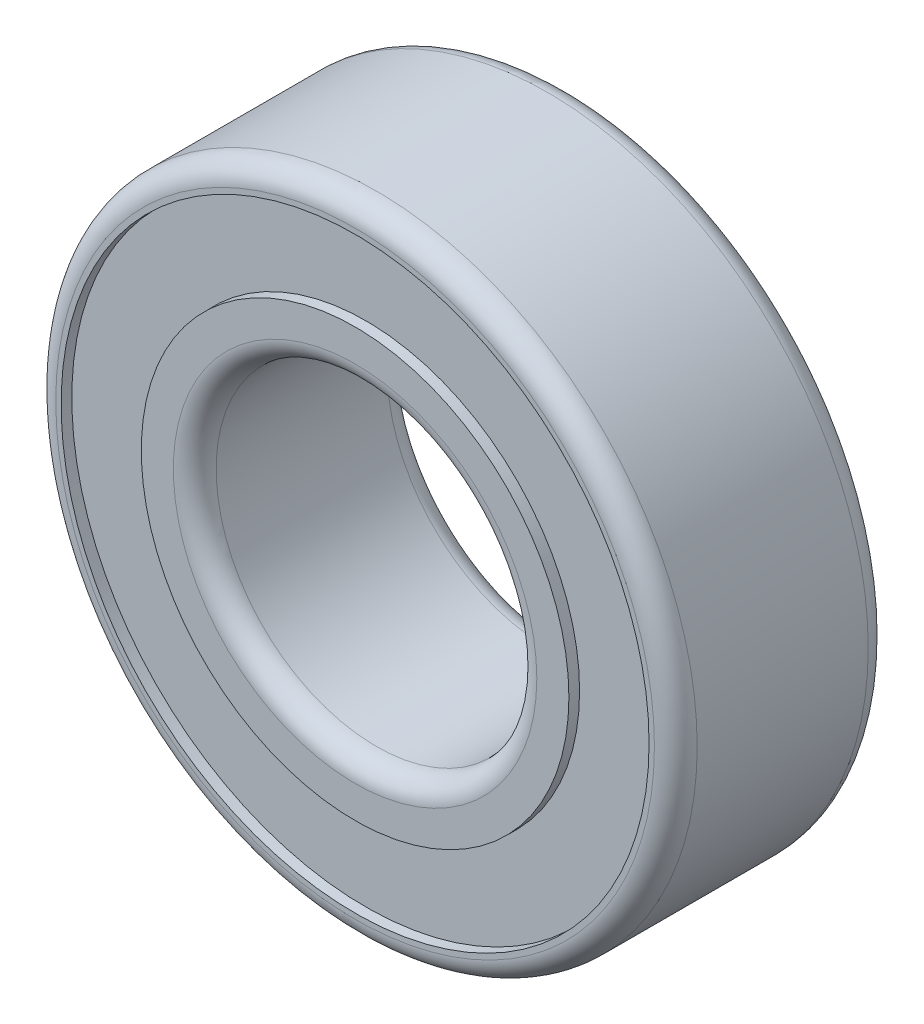
ISO-10303-21;
HEADER;
FILE_DESCRIPTION(('STEP AP214'),'2;1');
FILE_NAME('part.step','',(''),(''),'','','');
FILE_SCHEMA(('AUTOMOTIVE_DESIGN { 1 0 10303 214 1 1 1 1 }'));
ENDSEC;
DATA;
#1=APPLICATION_CONTEXT('core data for automotive mechanical design processes');
#2=APPLICATION_PROTOCOL_DEFINITION('international standard','automotive_design',2000,#1);
#3=PRODUCT_CONTEXT('',#1,'mechanical');
#4=PRODUCT('Part','Part','',(#3));
#5=PRODUCT_RELATED_PRODUCT_CATEGORY('part','',(#4));
#6=PRODUCT_DEFINITION_FORMATION('','',#4);
#7=PRODUCT_DEFINITION_CONTEXT('part definition',#1,'design');
#8=PRODUCT_DEFINITION('design','',#6,#7);
#9=PRODUCT_DEFINITION_SHAPE('','',#8);
#10=(LENGTH_UNIT() NAMED_UNIT(*) SI_UNIT(.MILLI.,.METRE.));
#11=(NAMED_UNIT(*) PLANE_ANGLE_UNIT() SI_UNIT($,.RADIAN.));
#12=(NAMED_UNIT(*) SI_UNIT($,.STERADIAN.) SOLID_ANGLE_UNIT());
#13=UNCERTAINTY_MEASURE_WITH_UNIT(LENGTH_MEASURE(1.E-05),#10,'distance_accuracy_value','');
#14=(GEOMETRIC_REPRESENTATION_CONTEXT(3) GLOBAL_UNCERTAINTY_ASSIGNED_CONTEXT((#13)) GLOBAL_UNIT_ASSIGNED_CONTEXT((#10,
#11,#12)) REPRESENTATION_CONTEXT('',''));
#15=CARTESIAN_POINT('',(0.,0.,0.));
#16=DIRECTION('',(0.,0.,1.));
#17=DIRECTION('',(1.,0.,0.));
#18=AXIS2_PLACEMENT_3D('',#15,#16,#17);
#19=CARTESIAN_POINT('',(0.,0.,-2.));
#20=DIRECTION('',(0.,0.,1.));
#21=DIRECTION('',(1.,0.,0.));
#22=AXIS2_PLACEMENT_3D('',#19,#20,#21);
#23=PLANE('',#22);
#24=CARTESIAN_POINT('',(0.,0.,-2.));
#25=DIRECTION('',(0.,0.,1.));
#26=DIRECTION('',(1.,0.,0.));
#27=AXIS2_PLACEMENT_3D('',#24,#25,#26);
#28=CIRCLE('',#27,3.4);
#29=CARTESIAN_POINT('',(3.4,0.,-2.));
#30=VERTEX_POINT('',#29);
#31=EDGE_CURVE('E74',#30,#30,#28,.T.);
#32=ORIENTED_EDGE('',*,*,#31,.T.);
#33=EDGE_LOOP('',(#32));
#34=FACE_BOUND('',#33,.T.);
#35=CARTESIAN_POINT('',(0.,0.,-2.));
#36=DIRECTION('',(0.,0.,1.));
#37=DIRECTION('',(1.,0.,0.));
#38=AXIS2_PLACEMENT_3D('',#35,#36,#37);
#39=CIRCLE('',#38,4.);
#40=CARTESIAN_POINT('',(4.,0.,-2.));
#41=VERTEX_POINT('',#40);
#42=EDGE_CURVE('E100',#41,#41,#39,.T.);
#43=ORIENTED_EDGE('',*,*,#42,.F.);
#44=EDGE_LOOP('',(#43));
#45=FACE_BOUND('',#44,.T.);
#46=ADVANCED_FACE('F34',(#34,#45),#23,.F.);
#47=CARTESIAN_POINT('',(0.,0.,2.));
#48=DIRECTION('',(0.,0.,1.));
#49=DIRECTION('',(1.,0.,0.));
#50=AXIS2_PLACEMENT_3D('',#47,#48,#49);
#51=PLANE('',#50);
#52=CARTESIAN_POINT('',(0.,0.,2.));
#53=DIRECTION('',(0.,0.,1.));
#54=DIRECTION('',(1.,0.,0.));
#55=AXIS2_PLACEMENT_3D('',#52,#53,#54);
#56=CIRCLE('',#55,3.4);
#57=CARTESIAN_POINT('',(3.4,0.,2.));
#58=VERTEX_POINT('',#57);
#59=EDGE_CURVE('E62',#58,#58,#56,.F.);
#60=ORIENTED_EDGE('',*,*,#59,.T.);
#61=EDGE_LOOP('',(#60));
#62=FACE_BOUND('',#61,.T.);
#63=CARTESIAN_POINT('',(0.,0.,2.));
#64=DIRECTION('',(0.,0.,1.));
#65=DIRECTION('',(1.,0.,0.));
#66=AXIS2_PLACEMENT_3D('',#63,#64,#65);
#67=CIRCLE('',#66,4.);
#68=CARTESIAN_POINT('',(4.,0.,2.));
#69=VERTEX_POINT('',#68);
#70=EDGE_CURVE('E85',#69,#69,#67,.T.);
#71=ORIENTED_EDGE('',*,*,#70,.T.);
#72=EDGE_LOOP('',(#71));
#73=FACE_BOUND('',#72,.T.);
#74=ADVANCED_FACE('F118',(#62,#73),#51,.T.);
#75=CARTESIAN_POINT('',(0.,0.,2.));
#76=DIRECTION('',(0.,0.,1.));
#77=DIRECTION('',(1.,0.,0.));
#78=AXIS2_PLACEMENT_3D('',#75,#76,#77);
#79=CIRCLE('',#78,5.6);
#80=CARTESIAN_POINT('',(5.6,0.,2.));
#81=VERTEX_POINT('',#80);
#82=EDGE_CURVE('E10',#81,#81,#79,.T.);
#83=ORIENTED_EDGE('',*,*,#82,.T.);
#84=EDGE_LOOP('',(#83));
#85=FACE_BOUND('',#84,.T.);
#86=CARTESIAN_POINT('',(0.,0.,2.));
#87=DIRECTION('',(0.,0.,1.));
#88=DIRECTION('',(1.,0.,0.));
#89=AXIS2_PLACEMENT_3D('',#86,#87,#88);
#90=CIRCLE('',#89,5.5);
#91=CARTESIAN_POINT('',(5.5,0.,2.));
#92=VERTEX_POINT('',#91);
#93=EDGE_CURVE('E78',#92,#92,#90,.T.);
#94=ORIENTED_EDGE('',*,*,#93,.F.);
#95=EDGE_LOOP('',(#94));
#96=FACE_BOUND('',#95,.T.);
#97=ADVANCED_FACE('F125',(#85,#96),#51,.T.);
#98=CARTESIAN_POINT('',(0.,0.,-2.));
#99=DIRECTION('',(0.,0.,1.));
#100=DIRECTION('',(1.,0.,0.));
#101=AXIS2_PLACEMENT_3D('',#98,#99,#100);
#102=CIRCLE('',#101,5.6);
#103=CARTESIAN_POINT('',(5.6,0.,-2.));
#104=VERTEX_POINT('',#103);
#105=EDGE_CURVE('E42',#104,#104,#102,.F.);
#106=ORIENTED_EDGE('',*,*,#105,.T.);
#107=EDGE_LOOP('',(#106));
#108=FACE_BOUND('',#107,.T.);
#109=CARTESIAN_POINT('',(0.,0.,-2.));
#110=DIRECTION('',(0.,0.,1.));
#111=DIRECTION('',(1.,0.,0.));
#112=AXIS2_PLACEMENT_3D('',#109,#110,#111);
#113=CIRCLE('',#112,5.5);
#114=CARTESIAN_POINT('',(5.5,0.,-2.));
#115=VERTEX_POINT('',#114);
#116=EDGE_CURVE('E93',#115,#115,#113,.T.);
#117=ORIENTED_EDGE('',*,*,#116,.T.);
#118=EDGE_LOOP('',(#117));
#119=FACE_BOUND('',#118,.T.);
#120=ADVANCED_FACE('F121',(#108,#119),#23,.F.);
#121=CARTESIAN_POINT('',(0.,0.,2.));
#122=DIRECTION('',(0.,0.,-1.));
#123=DIRECTION('',(-1.,0.,0.));
#124=AXIS2_PLACEMENT_3D('',#121,#122,#123);
#125=CYLINDRICAL_SURFACE('',#124,6.);
#126=CARTESIAN_POINT('',(0.,0.,-1.6));
#127=DIRECTION('',(0.,0.,1.));
#128=DIRECTION('',(1.,0.,0.));
#129=AXIS2_PLACEMENT_3D('',#126,#127,#128);
#130=CIRCLE('',#129,6.);
#131=CARTESIAN_POINT('',(6.,0.,-1.6));
#132=VERTEX_POINT('',#131);
#133=EDGE_CURVE('E49',#132,#132,#130,.T.);
#134=ORIENTED_EDGE('',*,*,#133,.T.);
#135=EDGE_LOOP('',(#134));
#136=FACE_BOUND('',#135,.T.);
#137=CARTESIAN_POINT('',(0.,0.,1.6));
#138=DIRECTION('',(0.,0.,1.));
#139=DIRECTION('',(1.,0.,0.));
#140=AXIS2_PLACEMENT_3D('',#137,#138,#139);
#141=CIRCLE('',#140,6.);
#142=CARTESIAN_POINT('',(6.,0.,1.6));
#143=VERTEX_POINT('',#142);
#144=EDGE_CURVE('E56',#143,#143,#141,.F.);
#145=ORIENTED_EDGE('',*,*,#144,.T.);
#146=EDGE_LOOP('',(#145));
#147=FACE_BOUND('',#146,.T.);
#148=ADVANCED_FACE('F130',(#136,#147),#125,.T.);
#149=CARTESIAN_POINT('',(0.,0.,2.));
#150=DIRECTION('',(0.,0.,-1.));
#151=DIRECTION('',(-1.,0.,0.));
#152=AXIS2_PLACEMENT_3D('',#149,#150,#151);
#153=CYLINDRICAL_SURFACE('',#152,3.);
#154=CARTESIAN_POINT('',(0.,0.,-1.6));
#155=DIRECTION('',(0.,0.,1.));
#156=DIRECTION('',(1.,0.,0.));
#157=AXIS2_PLACEMENT_3D('',#154,#155,#156);
#158=CIRCLE('',#157,3.);
#159=CARTESIAN_POINT('',(3.,0.,-1.6));
#160=VERTEX_POINT('',#159);
#161=EDGE_CURVE('E66',#160,#160,#158,.F.);
#162=ORIENTED_EDGE('',*,*,#161,.T.);
#163=EDGE_LOOP('',(#162));
#164=FACE_BOUND('',#163,.T.);
#165=CARTESIAN_POINT('',(0.,0.,1.6));
#166=DIRECTION('',(0.,0.,1.));
#167=DIRECTION('',(1.,0.,0.));
#168=AXIS2_PLACEMENT_3D('',#165,#166,#167);
#169=CIRCLE('',#168,3.);
#170=CARTESIAN_POINT('',(3.,0.,1.6));
#171=VERTEX_POINT('',#170);
#172=EDGE_CURVE('E70',#171,#171,#169,.T.);
#173=ORIENTED_EDGE('',*,*,#172,.T.);
#174=EDGE_LOOP('',(#173));
#175=FACE_BOUND('',#174,.T.);
#176=ADVANCED_FACE('F135',(#164,#175),#153,.F.);
#177=CARTESIAN_POINT('',(0.,0.,1.8));
#178=DIRECTION('',(0.,0.,1.));
#179=DIRECTION('',(1.,0.,0.));
#180=AXIS2_PLACEMENT_3D('',#177,#178,#179);
#181=CYLINDRICAL_SURFACE('',#180,5.5);
#182=CARTESIAN_POINT('',(0.,0.,1.8));
#183=DIRECTION('',(0.,0.,1.));
#184=DIRECTION('',(1.,0.,0.));
#185=AXIS2_PLACEMENT_3D('',#182,#183,#184);
#186=CIRCLE('',#185,5.5);
#187=CARTESIAN_POINT('',(5.5,0.,1.8));
#188=VERTEX_POINT('',#187);
#189=EDGE_CURVE('E77',#188,#188,#186,.T.);
#190=ORIENTED_EDGE('',*,*,#189,.F.);
#191=EDGE_LOOP('',(#190));
#192=FACE_BOUND('',#191,.T.);
#193=ORIENTED_EDGE('',*,*,#93,.T.);
#194=EDGE_LOOP('',(#193));
#195=FACE_BOUND('',#194,.T.);
#196=ADVANCED_FACE('F156',(#192,#195),#181,.F.);
#197=CARTESIAN_POINT('',(0.,0.,1.8));
#198=DIRECTION('',(0.,0.,1.));
#199=DIRECTION('',(1.,0.,0.));
#200=AXIS2_PLACEMENT_3D('',#197,#198,#199);
#201=PLANE('',#200);
#202=CARTESIAN_POINT('',(0.,0.,1.8));
#203=DIRECTION('',(0.,0.,1.));
#204=DIRECTION('',(1.,0.,0.));
#205=AXIS2_PLACEMENT_3D('',#202,#203,#204);
#206=CIRCLE('',#205,4.);
#207=CARTESIAN_POINT('',(4.,0.,1.8));
#208=VERTEX_POINT('',#207);
#209=EDGE_CURVE('E81',#208,#208,#206,.T.);
#210=ORIENTED_EDGE('',*,*,#209,.F.);
#211=EDGE_LOOP('',(#210));
#212=FACE_BOUND('',#211,.T.);
#213=ORIENTED_EDGE('',*,*,#189,.T.);
#214=EDGE_LOOP('',(#213));
#215=FACE_BOUND('',#214,.T.);
#216=ADVANCED_FACE('F152',(#212,#215),#201,.T.);
#217=CARTESIAN_POINT('',(0.,0.,1.8));
#218=DIRECTION('',(0.,0.,1.));
#219=DIRECTION('',(1.,0.,0.));
#220=AXIS2_PLACEMENT_3D('',#217,#218,#219);
#221=CYLINDRICAL_SURFACE('',#220,4.);
#222=ORIENTED_EDGE('',*,*,#209,.T.);
#223=EDGE_LOOP('',(#222));
#224=FACE_BOUND('',#223,.T.);
#225=ORIENTED_EDGE('',*,*,#70,.F.);
#226=EDGE_LOOP('',(#225));
#227=FACE_BOUND('',#226,.T.);
#228=ADVANCED_FACE('F146',(#224,#227),#221,.T.);
#229=CARTESIAN_POINT('',(0.,0.,-1.8));
#230=DIRECTION('',(0.,0.,-1.));
#231=DIRECTION('',(1.,0.,0.));
#232=AXIS2_PLACEMENT_3D('',#229,#230,#231);
#233=PLANE('',#232);
#234=CARTESIAN_POINT('',(0.,0.,-1.8));
#235=DIRECTION('',(0.,0.,1.));
#236=DIRECTION('',(1.,0.,0.));
#237=AXIS2_PLACEMENT_3D('',#234,#235,#236);
#238=CIRCLE('',#237,5.5);
#239=CARTESIAN_POINT('',(5.5,0.,-1.8));
#240=VERTEX_POINT('',#239);
#241=EDGE_CURVE('E89',#240,#240,#238,.T.);
#242=ORIENTED_EDGE('',*,*,#241,.F.);
#243=EDGE_LOOP('',(#242));
#244=FACE_BOUND('',#243,.T.);
#245=CARTESIAN_POINT('',(0.,0.,-1.8));
#246=DIRECTION('',(0.,0.,1.));
#247=DIRECTION('',(1.,0.,0.));
#248=AXIS2_PLACEMENT_3D('',#245,#246,#247);
#249=CIRCLE('',#248,4.);
#250=CARTESIAN_POINT('',(4.,0.,-1.8));
#251=VERTEX_POINT('',#250);
#252=EDGE_CURVE('E96',#251,#251,#249,.T.);
#253=ORIENTED_EDGE('',*,*,#252,.T.);
#254=EDGE_LOOP('',(#253));
#255=FACE_BOUND('',#254,.T.);
#256=ADVANCED_FACE('F107',(#244,#255),#233,.T.);
#257=CARTESIAN_POINT('',(0.,0.,-1.8));
#258=DIRECTION('',(0.,0.,-1.));
#259=DIRECTION('',(-1.,0.,0.));
#260=AXIS2_PLACEMENT_3D('',#257,#258,#259);
#261=CYLINDRICAL_SURFACE('',#260,5.5);
#262=ORIENTED_EDGE('',*,*,#241,.T.);
#263=EDGE_LOOP('',(#262));
#264=FACE_BOUND('',#263,.T.);
#265=ORIENTED_EDGE('',*,*,#116,.F.);
#266=EDGE_LOOP('',(#265));
#267=FACE_BOUND('',#266,.T.);
#268=ADVANCED_FACE('F113',(#264,#267),#261,.F.);
#269=CARTESIAN_POINT('',(0.,0.,-1.8));
#270=DIRECTION('',(0.,0.,-1.));
#271=DIRECTION('',(-1.,0.,0.));
#272=AXIS2_PLACEMENT_3D('',#269,#270,#271);
#273=CYLINDRICAL_SURFACE('',#272,4.);
#274=ORIENTED_EDGE('',*,*,#252,.F.);
#275=EDGE_LOOP('',(#274));
#276=FACE_BOUND('',#275,.T.);
#277=ORIENTED_EDGE('',*,*,#42,.T.);
#278=EDGE_LOOP('',(#277));
#279=FACE_BOUND('',#278,.T.);
#280=ADVANCED_FACE('F109',(#276,#279),#273,.T.);
#281=CARTESIAN_POINT('',(0.,0.,-1.6));
#282=DIRECTION('',(0.,0.,1.));
#283=DIRECTION('',(1.,0.,0.));
#284=AXIS2_PLACEMENT_3D('',#281,#282,#283);
#285=TOROIDAL_SURFACE('',#284,3.4,0.4);
#286=ORIENTED_EDGE('',*,*,#161,.F.);
#287=EDGE_LOOP('',(#286));
#288=FACE_BOUND('',#287,.T.);
#289=ORIENTED_EDGE('',*,*,#31,.F.);
#290=EDGE_LOOP('',(#289));
#291=FACE_BOUND('',#290,.T.);
#292=ADVANCED_FACE('F112',(#288,#291),#285,.T.);
#293=CARTESIAN_POINT('',(0.,0.,1.6));
#294=DIRECTION('',(0.,0.,1.));
#295=DIRECTION('',(1.,0.,0.));
#296=AXIS2_PLACEMENT_3D('',#293,#294,#295);
#297=TOROIDAL_SURFACE('',#296,3.4,0.4);
#298=ORIENTED_EDGE('',*,*,#59,.F.);
#299=EDGE_LOOP('',(#298));
#300=FACE_BOUND('',#299,.T.);
#301=ORIENTED_EDGE('',*,*,#172,.F.);
#302=EDGE_LOOP('',(#301));
#303=FACE_BOUND('',#302,.T.);
#304=ADVANCED_FACE('F169',(#300,#303),#297,.T.);
#305=CARTESIAN_POINT('',(0.,0.,-1.6));
#306=DIRECTION('',(0.,0.,1.));
#307=DIRECTION('',(1.,0.,0.));
#308=AXIS2_PLACEMENT_3D('',#305,#306,#307);
#309=TOROIDAL_SURFACE('',#308,5.6,0.4);
#310=ORIENTED_EDGE('',*,*,#105,.F.);
#311=EDGE_LOOP('',(#310));
#312=FACE_BOUND('',#311,.T.);
#313=ORIENTED_EDGE('',*,*,#133,.F.);
#314=EDGE_LOOP('',(#313));
#315=FACE_BOUND('',#314,.T.);
#316=ADVANCED_FACE('F171',(#312,#315),#309,.T.);
#317=CARTESIAN_POINT('',(0.,0.,1.6));
#318=DIRECTION('',(0.,0.,1.));
#319=DIRECTION('',(1.,0.,0.));
#320=AXIS2_PLACEMENT_3D('',#317,#318,#319);
#321=TOROIDAL_SURFACE('',#320,5.6,0.4);
#322=ORIENTED_EDGE('',*,*,#144,.F.);
#323=EDGE_LOOP('',(#322));
#324=FACE_BOUND('',#323,.T.);
#325=ORIENTED_EDGE('',*,*,#82,.F.);
#326=EDGE_LOOP('',(#325));
#327=FACE_BOUND('',#326,.T.);
#328=ADVANCED_FACE('F36',(#324,#327),#321,.T.);
#329=CLOSED_SHELL('',(#46,#74,#97,#120,#148,#176,#196,#216,#228,#256,#268,#280,#292,#304,#316,#328));
#330=MANIFOLD_SOLID_BREP('B2',#329);
#331=ADVANCED_BREP_SHAPE_REPRESENTATION('',(#18,#330),#14);
#332=SHAPE_DEFINITION_REPRESENTATION(#9,#331);
ENDSEC;
END-ISO-10303-21;
